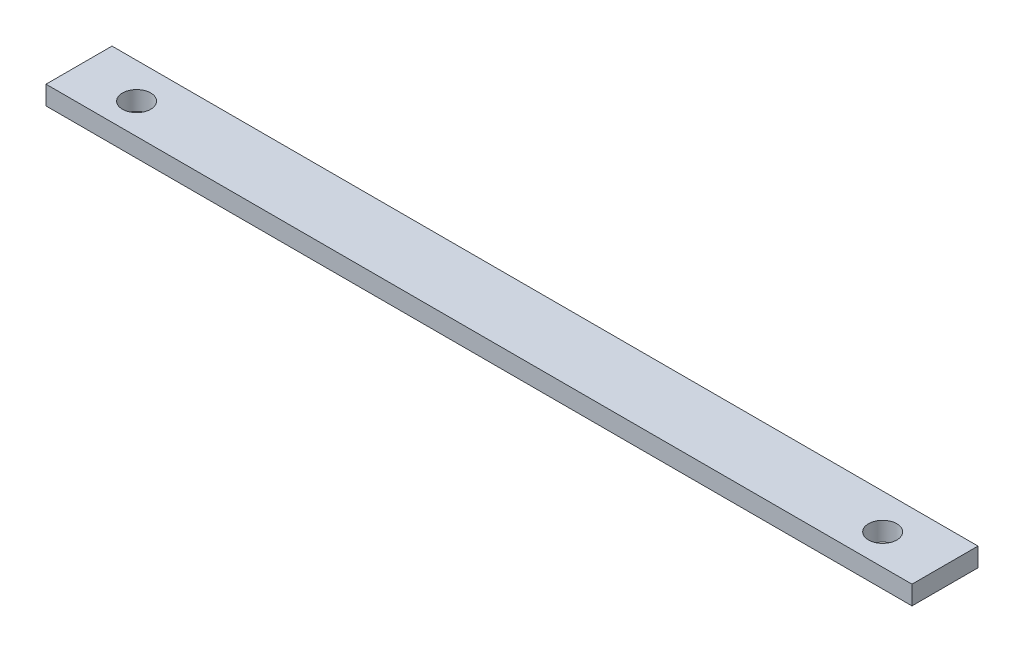
ISO-10303-21;
HEADER;
FILE_DESCRIPTION(('STEP AP214'),'2;1');
FILE_NAME('part.step','',(''),(''),'','','');
FILE_SCHEMA(('AUTOMOTIVE_DESIGN { 1 0 10303 214 1 1 1 1 }'));
ENDSEC;
DATA;
#1=APPLICATION_CONTEXT('core data for automotive mechanical design processes');
#2=APPLICATION_PROTOCOL_DEFINITION('international standard','automotive_design',2000,#1);
#3=PRODUCT_CONTEXT('',#1,'mechanical');
#4=PRODUCT('Part','Part','',(#3));
#5=PRODUCT_RELATED_PRODUCT_CATEGORY('part','',(#4));
#6=PRODUCT_DEFINITION_FORMATION('','',#4);
#7=PRODUCT_DEFINITION_CONTEXT('part definition',#1,'design');
#8=PRODUCT_DEFINITION('design','',#6,#7);
#9=PRODUCT_DEFINITION_SHAPE('','',#8);
#10=(LENGTH_UNIT() NAMED_UNIT(*) SI_UNIT(.MILLI.,.METRE.));
#11=(NAMED_UNIT(*) PLANE_ANGLE_UNIT() SI_UNIT($,.RADIAN.));
#12=(NAMED_UNIT(*) SI_UNIT($,.STERADIAN.) SOLID_ANGLE_UNIT());
#13=UNCERTAINTY_MEASURE_WITH_UNIT(LENGTH_MEASURE(1.E-05),#10,'distance_accuracy_value','');
#14=(GEOMETRIC_REPRESENTATION_CONTEXT(3) GLOBAL_UNCERTAINTY_ASSIGNED_CONTEXT((#13)) GLOBAL_UNIT_ASSIGNED_CONTEXT((#10,
#11,#12)) REPRESENTATION_CONTEXT('',''));
#15=CARTESIAN_POINT('',(0.,0.,0.));
#16=DIRECTION('',(0.,0.,1.));
#17=DIRECTION('',(1.,0.,0.));
#18=AXIS2_PLACEMENT_3D('',#15,#16,#17);
#19=CARTESIAN_POINT('',(91.833333351,4.,7.));
#20=DIRECTION('',(-1.,0.,0.));
#21=DIRECTION('',(0.,0.,1.));
#22=AXIS2_PLACEMENT_3D('',#19,#20,#21);
#23=PLANE('',#22);
#24=DIRECTION('',(0.,0.,-1.));
#25=VECTOR('',#24,1.);
#26=CARTESIAN_POINT('',(91.833333351,0.,7.));
#27=LINE('',#26,#25);
#28=CARTESIAN_POINT('',(91.833333351,0.,7.));
#29=VERTEX_POINT('',#28);
#30=CARTESIAN_POINT('',(91.833333351,0.,-7.));
#31=VERTEX_POINT('',#30);
#32=EDGE_CURVE('E110',#29,#31,#27,.T.);
#33=ORIENTED_EDGE('',*,*,#32,.T.);
#34=DIRECTION('',(0.,-1.,0.));
#35=VECTOR('',#34,1.);
#36=CARTESIAN_POINT('',(91.833333351,4.,-7.));
#37=LINE('',#36,#35);
#38=CARTESIAN_POINT('',(91.833333351,4.,-7.));
#39=VERTEX_POINT('',#38);
#40=EDGE_CURVE('E11',#39,#31,#37,.T.);
#41=ORIENTED_EDGE('',*,*,#40,.F.);
#42=DIRECTION('',(0.,0.,-1.));
#43=VECTOR('',#42,1.);
#44=CARTESIAN_POINT('',(91.833333351,4.,7.));
#45=LINE('',#44,#43);
#46=CARTESIAN_POINT('',(91.833333351,4.,7.));
#47=VERTEX_POINT('',#46);
#48=EDGE_CURVE('E93',#47,#39,#45,.T.);
#49=ORIENTED_EDGE('',*,*,#48,.F.);
#50=DIRECTION('',(0.,-1.,0.));
#51=VECTOR('',#50,1.);
#52=CARTESIAN_POINT('',(91.833333351,4.,7.));
#53=LINE('',#52,#51);
#54=EDGE_CURVE('E106',#47,#29,#53,.T.);
#55=ORIENTED_EDGE('',*,*,#54,.T.);
#56=EDGE_LOOP('',(#33,#41,#49,#55));
#57=FACE_BOUND('',#56,.T.);
#58=ADVANCED_FACE('F41',(#57),#23,.F.);
#59=CARTESIAN_POINT('',(-91.833333351,4.,-7.));
#60=DIRECTION('',(0.,0.,1.));
#61=DIRECTION('',(1.,0.,0.));
#62=AXIS2_PLACEMENT_3D('',#59,#60,#61);
#63=PLANE('',#62);
#64=DIRECTION('',(-1.,0.,0.));
#65=VECTOR('',#64,1.);
#66=CARTESIAN_POINT('',(-91.833333351,0.,-7.));
#67=LINE('',#66,#65);
#68=CARTESIAN_POINT('',(-91.833333351,0.,-7.));
#69=VERTEX_POINT('',#68);
#70=EDGE_CURVE('E98',#31,#69,#67,.T.);
#71=ORIENTED_EDGE('',*,*,#70,.T.);
#72=DIRECTION('',(0.,-1.,0.));
#73=VECTOR('',#72,1.);
#74=CARTESIAN_POINT('',(-91.833333351,4.,-7.));
#75=LINE('',#74,#73);
#76=CARTESIAN_POINT('',(-91.833333351,4.,-7.));
#77=VERTEX_POINT('',#76);
#78=EDGE_CURVE('E50',#77,#69,#75,.T.);
#79=ORIENTED_EDGE('',*,*,#78,.F.);
#80=DIRECTION('',(-1.,0.,0.));
#81=VECTOR('',#80,1.);
#82=CARTESIAN_POINT('',(-91.833333351,4.,-7.));
#83=LINE('',#82,#81);
#84=EDGE_CURVE('E88',#39,#77,#83,.T.);
#85=ORIENTED_EDGE('',*,*,#84,.F.);
#86=ORIENTED_EDGE('',*,*,#40,.T.);
#87=EDGE_LOOP('',(#71,#79,#85,#86));
#88=FACE_BOUND('',#87,.T.);
#89=ADVANCED_FACE('F97',(#88),#63,.F.);
#90=CARTESIAN_POINT('',(-91.833333351,4.,7.));
#91=DIRECTION('',(1.,0.,0.));
#92=DIRECTION('',(0.,0.,-1.));
#93=AXIS2_PLACEMENT_3D('',#90,#91,#92);
#94=PLANE('',#93);
#95=DIRECTION('',(0.,0.,1.));
#96=VECTOR('',#95,1.);
#97=CARTESIAN_POINT('',(-91.833333351,0.,7.));
#98=LINE('',#97,#96);
#99=CARTESIAN_POINT('',(-91.833333351,0.,7.));
#100=VERTEX_POINT('',#99);
#101=EDGE_CURVE('E75',#69,#100,#98,.T.);
#102=ORIENTED_EDGE('',*,*,#101,.T.);
#103=DIRECTION('',(0.,-1.,0.));
#104=VECTOR('',#103,1.);
#105=CARTESIAN_POINT('',(-91.833333351,4.,7.));
#106=LINE('',#105,#104);
#107=CARTESIAN_POINT('',(-91.833333351,4.,7.));
#108=VERTEX_POINT('',#107);
#109=EDGE_CURVE('E100',#108,#100,#106,.T.);
#110=ORIENTED_EDGE('',*,*,#109,.F.);
#111=DIRECTION('',(0.,0.,1.));
#112=VECTOR('',#111,1.);
#113=CARTESIAN_POINT('',(-91.833333351,4.,7.));
#114=LINE('',#113,#112);
#115=EDGE_CURVE('E91',#77,#108,#114,.T.);
#116=ORIENTED_EDGE('',*,*,#115,.F.);
#117=ORIENTED_EDGE('',*,*,#78,.T.);
#118=EDGE_LOOP('',(#102,#110,#116,#117));
#119=FACE_BOUND('',#118,.T.);
#120=ADVANCED_FACE('F101',(#119),#94,.F.);
#121=CARTESIAN_POINT('',(-91.833333351,4.,7.));
#122=DIRECTION('',(0.,0.,-1.));
#123=DIRECTION('',(-1.,0.,0.));
#124=AXIS2_PLACEMENT_3D('',#121,#122,#123);
#125=PLANE('',#124);
#126=DIRECTION('',(1.,0.,0.));
#127=VECTOR('',#126,1.);
#128=CARTESIAN_POINT('',(-91.833333351,0.,7.));
#129=LINE('',#128,#127);
#130=EDGE_CURVE('E81',#100,#29,#129,.T.);
#131=ORIENTED_EDGE('',*,*,#130,.T.);
#132=ORIENTED_EDGE('',*,*,#54,.F.);
#133=DIRECTION('',(1.,0.,0.));
#134=VECTOR('',#133,1.);
#135=CARTESIAN_POINT('',(-91.833333351,4.,7.));
#136=LINE('',#135,#134);
#137=EDGE_CURVE('E58',#108,#47,#136,.T.);
#138=ORIENTED_EDGE('',*,*,#137,.F.);
#139=ORIENTED_EDGE('',*,*,#109,.T.);
#140=EDGE_LOOP('',(#131,#132,#138,#139));
#141=FACE_BOUND('',#140,.T.);
#142=ADVANCED_FACE('F125',(#141),#125,.F.);
#143=CARTESIAN_POINT('',(0.,4.,0.));
#144=DIRECTION('',(0.,-1.,0.));
#145=DIRECTION('',(0.,0.,-1.));
#146=AXIS2_PLACEMENT_3D('',#143,#144,#145);
#147=PLANE('',#146);
#148=CARTESIAN_POINT('',(79.1166666490015,4.,0.499999999998802));
#149=DIRECTION('',(0.,1.,0.));
#150=DIRECTION('',(0.,0.,1.));
#151=AXIS2_PLACEMENT_3D('',#148,#149,#150);
#152=CIRCLE('',#151,3.00000000000001);
#153=CARTESIAN_POINT('',(79.1166666490015,4.,3.49999999999881));
#154=VERTEX_POINT('',#153);
#155=EDGE_CURVE('E141',#154,#154,#152,.T.);
#156=ORIENTED_EDGE('',*,*,#155,.F.);
#157=EDGE_LOOP('',(#156));
#158=FACE_BOUND('',#157,.T.);
#159=CARTESIAN_POINT('',(-79.1166666490015,4.,0.499999999999112));
#160=DIRECTION('',(0.,1.,0.));
#161=DIRECTION('',(0.,0.,-1.));
#162=AXIS2_PLACEMENT_3D('',#159,#160,#161);
#163=CIRCLE('',#162,3.);
#164=CARTESIAN_POINT('',(-79.1166666490015,4.,-2.50000000000089));
#165=VERTEX_POINT('',#164);
#166=EDGE_CURVE('E137',#165,#165,#163,.T.);
#167=ORIENTED_EDGE('',*,*,#166,.F.);
#168=EDGE_LOOP('',(#167));
#169=FACE_BOUND('',#168,.T.);
#170=ORIENTED_EDGE('',*,*,#48,.T.);
#171=ORIENTED_EDGE('',*,*,#84,.T.);
#172=ORIENTED_EDGE('',*,*,#115,.T.);
#173=ORIENTED_EDGE('',*,*,#137,.T.);
#174=EDGE_LOOP('',(#170,#171,#172,#173));
#175=FACE_BOUND('',#174,.T.);
#176=ADVANCED_FACE('F89',(#158,#169,#175),#147,.F.);
#177=CARTESIAN_POINT('',(0.,0.,0.));
#178=DIRECTION('',(0.,-1.,0.));
#179=DIRECTION('',(0.,0.,-1.));
#180=AXIS2_PLACEMENT_3D('',#177,#178,#179);
#181=PLANE('',#180);
#182=CARTESIAN_POINT('',(79.1166666490015,0.,0.499999999998802));
#183=DIRECTION('',(0.,1.,0.));
#184=DIRECTION('',(0.,0.,1.));
#185=AXIS2_PLACEMENT_3D('',#182,#183,#184);
#186=CIRCLE('',#185,3.00000000000001);
#187=CARTESIAN_POINT('',(79.1166666490015,0.,3.49999999999881));
#188=VERTEX_POINT('',#187);
#189=EDGE_CURVE('E114',#188,#188,#186,.T.);
#190=ORIENTED_EDGE('',*,*,#189,.T.);
#191=EDGE_LOOP('',(#190));
#192=FACE_BOUND('',#191,.T.);
#193=CARTESIAN_POINT('',(-79.1166666490015,0.,0.499999999999112));
#194=DIRECTION('',(0.,1.,0.));
#195=DIRECTION('',(0.,0.,-1.));
#196=AXIS2_PLACEMENT_3D('',#193,#194,#195);
#197=CIRCLE('',#196,3.);
#198=CARTESIAN_POINT('',(-79.1166666490015,0.,-2.50000000000089));
#199=VERTEX_POINT('',#198);
#200=EDGE_CURVE('E133',#199,#199,#197,.T.);
#201=ORIENTED_EDGE('',*,*,#200,.T.);
#202=EDGE_LOOP('',(#201));
#203=FACE_BOUND('',#202,.T.);
#204=ORIENTED_EDGE('',*,*,#32,.F.);
#205=ORIENTED_EDGE('',*,*,#130,.F.);
#206=ORIENTED_EDGE('',*,*,#101,.F.);
#207=ORIENTED_EDGE('',*,*,#70,.F.);
#208=EDGE_LOOP('',(#204,#205,#206,#207));
#209=FACE_BOUND('',#208,.T.);
#210=ADVANCED_FACE('F128',(#192,#203,#209),#181,.T.);
#211=CARTESIAN_POINT('',(-79.1166666490015,0.,0.499999999999112));
#212=DIRECTION('',(0.,1.,0.));
#213=DIRECTION('',(0.,0.,1.));
#214=AXIS2_PLACEMENT_3D('',#211,#212,#213);
#215=CYLINDRICAL_SURFACE('',#214,3.);
#216=ORIENTED_EDGE('',*,*,#200,.F.);
#217=EDGE_LOOP('',(#216));
#218=FACE_BOUND('',#217,.T.);
#219=ORIENTED_EDGE('',*,*,#166,.T.);
#220=EDGE_LOOP('',(#219));
#221=FACE_BOUND('',#220,.T.);
#222=ADVANCED_FACE('F155',(#218,#221),#215,.F.);
#223=CARTESIAN_POINT('',(79.1166666490015,0.,0.499999999998802));
#224=DIRECTION('',(0.,1.,0.));
#225=DIRECTION('',(0.,0.,1.));
#226=AXIS2_PLACEMENT_3D('',#223,#224,#225);
#227=CYLINDRICAL_SURFACE('',#226,3.00000000000001);
#228=ORIENTED_EDGE('',*,*,#189,.F.);
#229=EDGE_LOOP('',(#228));
#230=FACE_BOUND('',#229,.T.);
#231=ORIENTED_EDGE('',*,*,#155,.T.);
#232=EDGE_LOOP('',(#231));
#233=FACE_BOUND('',#232,.T.);
#234=ADVANCED_FACE('F152',(#230,#233),#227,.F.);
#235=CLOSED_SHELL('',(#58,#89,#120,#142,#176,#210,#222,#234));
#236=MANIFOLD_SOLID_BREP('B2',#235);
#237=ADVANCED_BREP_SHAPE_REPRESENTATION('',(#18,#236),#14);
#238=SHAPE_DEFINITION_REPRESENTATION(#9,#237);
ENDSEC;
END-ISO-10303-21;
